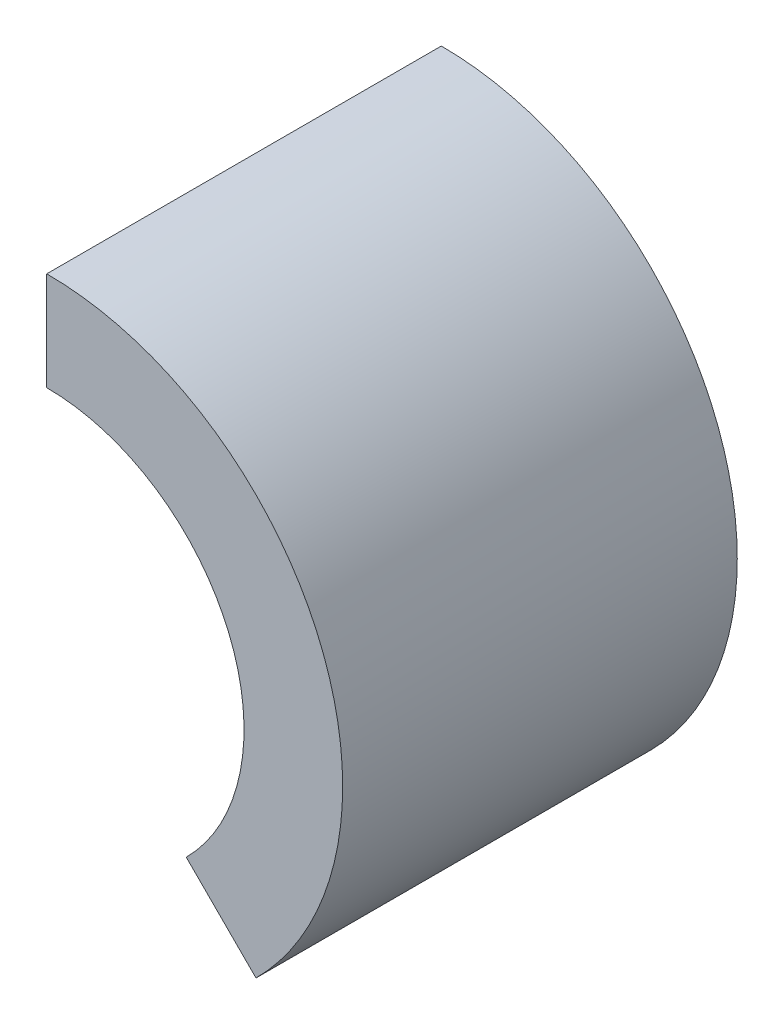
ISO-10303-21;
HEADER;
FILE_DESCRIPTION(('STEP AP214'),'2;1');
FILE_NAME('part.step','',(''),(''),'','','');
FILE_SCHEMA(('AUTOMOTIVE_DESIGN { 1 0 10303 214 1 1 1 1 }'));
ENDSEC;
DATA;
#1=APPLICATION_CONTEXT('core data for automotive mechanical design processes');
#2=APPLICATION_PROTOCOL_DEFINITION('international standard','automotive_design',2000,#1);
#3=PRODUCT_CONTEXT('',#1,'mechanical');
#4=PRODUCT('Part','Part','',(#3));
#5=PRODUCT_RELATED_PRODUCT_CATEGORY('part','',(#4));
#6=PRODUCT_DEFINITION_FORMATION('','',#4);
#7=PRODUCT_DEFINITION_CONTEXT('part definition',#1,'design');
#8=PRODUCT_DEFINITION('design','',#6,#7);
#9=PRODUCT_DEFINITION_SHAPE('','',#8);
#10=(LENGTH_UNIT() NAMED_UNIT(*) SI_UNIT(.MILLI.,.METRE.));
#11=(NAMED_UNIT(*) PLANE_ANGLE_UNIT() SI_UNIT($,.RADIAN.));
#12=(NAMED_UNIT(*) SI_UNIT($,.STERADIAN.) SOLID_ANGLE_UNIT());
#13=UNCERTAINTY_MEASURE_WITH_UNIT(LENGTH_MEASURE(1.E-05),#10,'distance_accuracy_value','');
#14=(GEOMETRIC_REPRESENTATION_CONTEXT(3) GLOBAL_UNCERTAINTY_ASSIGNED_CONTEXT((#13)) GLOBAL_UNIT_ASSIGNED_CONTEXT((#10,
#11,#12)) REPRESENTATION_CONTEXT('',''));
#15=CARTESIAN_POINT('',(0.,0.,0.));
#16=DIRECTION('',(0.,0.,1.));
#17=DIRECTION('',(1.,0.,0.));
#18=AXIS2_PLACEMENT_3D('',#15,#16,#17);
#19=CARTESIAN_POINT('',(0.,0.,40.));
#20=DIRECTION('',(0.,0.,-1.));
#21=DIRECTION('',(-1.,0.,0.));
#22=AXIS2_PLACEMENT_3D('',#19,#20,#21);
#23=CYLINDRICAL_SURFACE('',#22,20.);
#24=CARTESIAN_POINT('',(0.,0.,0.));
#25=DIRECTION('',(0.,0.,-1.));
#26=DIRECTION('',(-1.,0.,0.));
#27=AXIS2_PLACEMENT_3D('',#24,#25,#26);
#28=CIRCLE('',#27,20.);
#29=CARTESIAN_POINT('',(0.,20.,0.));
#30=VERTEX_POINT('',#29);
#31=CARTESIAN_POINT('',(14.1421356237309,-14.1421356237309,0.));
#32=VERTEX_POINT('',#31);
#33=EDGE_CURVE('E96',#30,#32,#28,.T.);
#34=ORIENTED_EDGE('',*,*,#33,.T.);
#35=DIRECTION('',(0.,0.,-1.));
#36=VECTOR('',#35,1.);
#37=CARTESIAN_POINT('',(14.1421356237309,-14.1421356237309,40.));
#38=LINE('',#37,#36);
#39=CARTESIAN_POINT('',(14.1421356237309,-14.1421356237309,40.));
#40=VERTEX_POINT('',#39);
#41=EDGE_CURVE('E11',#40,#32,#38,.T.);
#42=ORIENTED_EDGE('',*,*,#41,.F.);
#43=CARTESIAN_POINT('',(0.,0.,40.));
#44=DIRECTION('',(0.,0.,-1.));
#45=DIRECTION('',(-1.,0.,0.));
#46=AXIS2_PLACEMENT_3D('',#43,#44,#45);
#47=CIRCLE('',#46,20.);
#48=CARTESIAN_POINT('',(0.,20.,40.));
#49=VERTEX_POINT('',#48);
#50=EDGE_CURVE('E84',#49,#40,#47,.T.);
#51=ORIENTED_EDGE('',*,*,#50,.F.);
#52=DIRECTION('',(0.,0.,-1.));
#53=VECTOR('',#52,1.);
#54=CARTESIAN_POINT('',(0.,20.,40.));
#55=LINE('',#54,#53);
#56=EDGE_CURVE('E92',#49,#30,#55,.T.);
#57=ORIENTED_EDGE('',*,*,#56,.T.);
#58=EDGE_LOOP('',(#34,#42,#51,#57));
#59=FACE_BOUND('',#58,.T.);
#60=ADVANCED_FACE('F33',(#59),#23,.F.);
#61=CARTESIAN_POINT('',(14.1421356237309,-14.1421356237309,40.));
#62=DIRECTION('',(0.707106781186548,0.707106781186548,0.));
#63=DIRECTION('',(-0.707106781186548,0.707106781186548,0.));
#64=AXIS2_PLACEMENT_3D('',#61,#62,#63);
#65=PLANE('',#64);
#66=DIRECTION('',(0.707106781186548,-0.707106781186548,0.));
#67=VECTOR('',#66,1.);
#68=CARTESIAN_POINT('',(14.1421356237309,-14.1421356237309,0.));
#69=LINE('',#68,#67);
#70=CARTESIAN_POINT('',(21.2132034355964,-21.2132034355964,0.));
#71=VERTEX_POINT('',#70);
#72=EDGE_CURVE('E88',#32,#71,#69,.T.);
#73=ORIENTED_EDGE('',*,*,#72,.T.);
#74=DIRECTION('',(0.,0.,-1.));
#75=VECTOR('',#74,1.);
#76=CARTESIAN_POINT('',(21.2132034355964,-21.2132034355964,40.));
#77=LINE('',#76,#75);
#78=CARTESIAN_POINT('',(21.2132034355964,-21.2132034355964,40.));
#79=VERTEX_POINT('',#78);
#80=EDGE_CURVE('E41',#79,#71,#77,.T.);
#81=ORIENTED_EDGE('',*,*,#80,.F.);
#82=DIRECTION('',(0.707106781186548,-0.707106781186548,0.));
#83=VECTOR('',#82,1.);
#84=CARTESIAN_POINT('',(14.1421356237309,-14.1421356237309,40.));
#85=LINE('',#84,#83);
#86=EDGE_CURVE('E79',#40,#79,#85,.T.);
#87=ORIENTED_EDGE('',*,*,#86,.F.);
#88=ORIENTED_EDGE('',*,*,#41,.T.);
#89=EDGE_LOOP('',(#73,#81,#87,#88));
#90=FACE_BOUND('',#89,.T.);
#91=ADVANCED_FACE('F87',(#90),#65,.F.);
#92=CARTESIAN_POINT('',(0.,0.,40.));
#93=DIRECTION('',(0.,0.,-1.));
#94=DIRECTION('',(-1.,0.,0.));
#95=AXIS2_PLACEMENT_3D('',#92,#93,#94);
#96=CYLINDRICAL_SURFACE('',#95,30.);
#97=CARTESIAN_POINT('',(0.,0.,0.));
#98=DIRECTION('',(0.,0.,1.));
#99=DIRECTION('',(-1.,0.,0.));
#100=AXIS2_PLACEMENT_3D('',#97,#98,#99);
#101=CIRCLE('',#100,30.);
#102=CARTESIAN_POINT('',(0.,30.,0.));
#103=VERTEX_POINT('',#102);
#104=EDGE_CURVE('E66',#71,#103,#101,.T.);
#105=ORIENTED_EDGE('',*,*,#104,.T.);
#106=DIRECTION('',(0.,0.,-1.));
#107=VECTOR('',#106,1.);
#108=CARTESIAN_POINT('',(0.,30.,40.));
#109=LINE('',#108,#107);
#110=CARTESIAN_POINT('',(0.,30.,40.));
#111=VERTEX_POINT('',#110);
#112=EDGE_CURVE('E89',#111,#103,#109,.T.);
#113=ORIENTED_EDGE('',*,*,#112,.F.);
#114=CARTESIAN_POINT('',(0.,0.,40.));
#115=DIRECTION('',(0.,0.,1.));
#116=DIRECTION('',(-1.,0.,0.));
#117=AXIS2_PLACEMENT_3D('',#114,#115,#116);
#118=CIRCLE('',#117,30.);
#119=EDGE_CURVE('E82',#79,#111,#118,.T.);
#120=ORIENTED_EDGE('',*,*,#119,.F.);
#121=ORIENTED_EDGE('',*,*,#80,.T.);
#122=EDGE_LOOP('',(#105,#113,#120,#121));
#123=FACE_BOUND('',#122,.T.);
#124=ADVANCED_FACE('F90',(#123),#96,.T.);
#125=CARTESIAN_POINT('',(0.,30.,40.));
#126=DIRECTION('',(1.,0.,0.));
#127=DIRECTION('',(0.,0.,-1.));
#128=AXIS2_PLACEMENT_3D('',#125,#126,#127);
#129=PLANE('',#128);
#130=DIRECTION('',(0.,-1.,0.));
#131=VECTOR('',#130,1.);
#132=CARTESIAN_POINT('',(0.,30.,0.));
#133=LINE('',#132,#131);
#134=EDGE_CURVE('E72',#103,#30,#133,.T.);
#135=ORIENTED_EDGE('',*,*,#134,.T.);
#136=ORIENTED_EDGE('',*,*,#56,.F.);
#137=DIRECTION('',(0.,-1.,0.));
#138=VECTOR('',#137,1.);
#139=CARTESIAN_POINT('',(0.,30.,40.));
#140=LINE('',#139,#138);
#141=EDGE_CURVE('E49',#111,#49,#140,.T.);
#142=ORIENTED_EDGE('',*,*,#141,.F.);
#143=ORIENTED_EDGE('',*,*,#112,.T.);
#144=EDGE_LOOP('',(#135,#136,#142,#143));
#145=FACE_BOUND('',#144,.T.);
#146=ADVANCED_FACE('F103',(#145),#129,.F.);
#147=CARTESIAN_POINT('',(0.,0.,40.));
#148=DIRECTION('',(0.,0.,-1.));
#149=DIRECTION('',(-1.,0.,0.));
#150=AXIS2_PLACEMENT_3D('',#147,#148,#149);
#151=PLANE('',#150);
#152=ORIENTED_EDGE('',*,*,#50,.T.);
#153=ORIENTED_EDGE('',*,*,#86,.T.);
#154=ORIENTED_EDGE('',*,*,#119,.T.);
#155=ORIENTED_EDGE('',*,*,#141,.T.);
#156=EDGE_LOOP('',(#152,#153,#154,#155));
#157=FACE_BOUND('',#156,.T.);
#158=ADVANCED_FACE('F80',(#157),#151,.F.);
#159=CARTESIAN_POINT('',(0.,0.,0.));
#160=DIRECTION('',(0.,0.,-1.));
#161=DIRECTION('',(-1.,0.,0.));
#162=AXIS2_PLACEMENT_3D('',#159,#160,#161);
#163=PLANE('',#162);
#164=ORIENTED_EDGE('',*,*,#33,.F.);
#165=ORIENTED_EDGE('',*,*,#134,.F.);
#166=ORIENTED_EDGE('',*,*,#104,.F.);
#167=ORIENTED_EDGE('',*,*,#72,.F.);
#168=EDGE_LOOP('',(#164,#165,#166,#167));
#169=FACE_BOUND('',#168,.T.);
#170=ADVANCED_FACE('F106',(#169),#163,.T.);
#171=CLOSED_SHELL('',(#60,#91,#124,#146,#158,#170));
#172=MANIFOLD_SOLID_BREP('B2',#171);
#173=ADVANCED_BREP_SHAPE_REPRESENTATION('',(#18,#172),#14);
#174=SHAPE_DEFINITION_REPRESENTATION(#9,#173);
ENDSEC;
END-ISO-10303-21;
